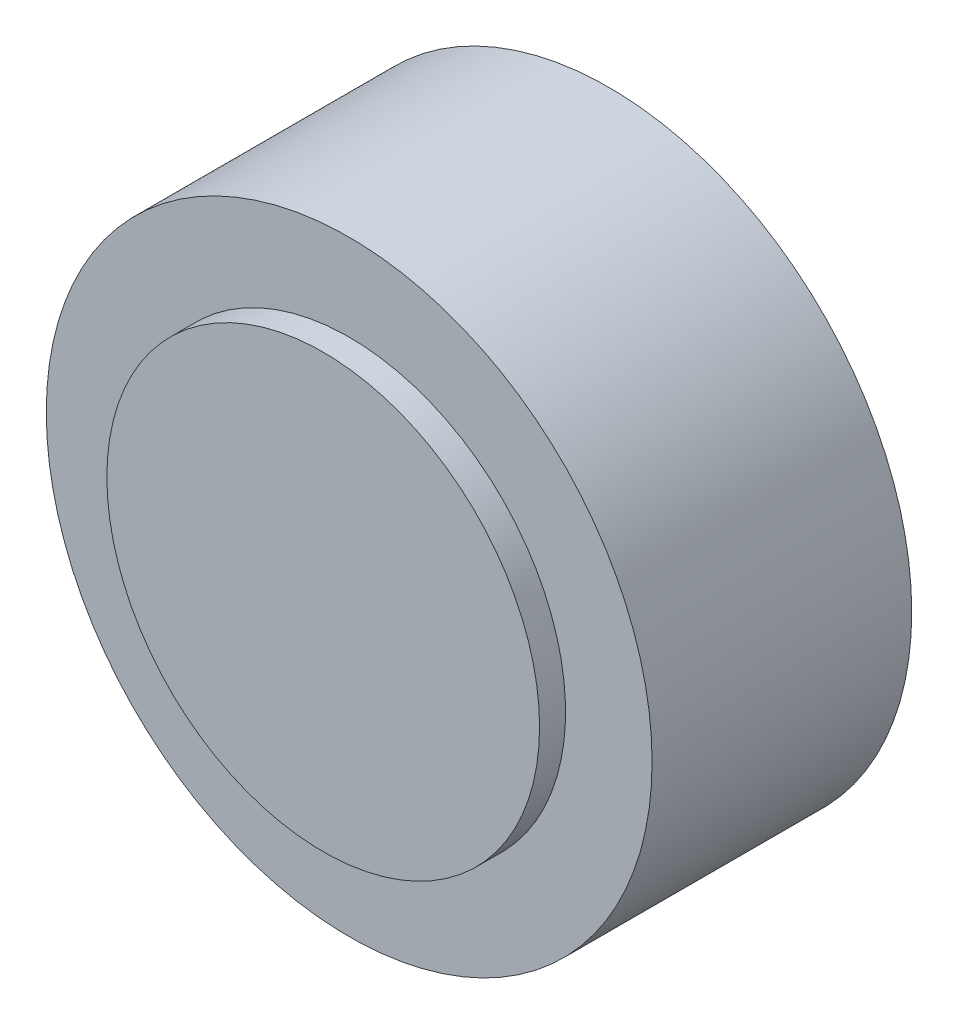
ISO-10303-21;
HEADER;
FILE_DESCRIPTION(('STEP AP214'),'2;1');
FILE_NAME('part.step','',(''),(''),'','','');
FILE_SCHEMA(('AUTOMOTIVE_DESIGN { 1 0 10303 214 1 1 1 1 }'));
ENDSEC;
DATA;
#1=APPLICATION_CONTEXT('core data for automotive mechanical design processes');
#2=APPLICATION_PROTOCOL_DEFINITION('international standard','automotive_design',2000,#1);
#3=PRODUCT_CONTEXT('',#1,'mechanical');
#4=PRODUCT('Part','Part','',(#3));
#5=PRODUCT_RELATED_PRODUCT_CATEGORY('part','',(#4));
#6=PRODUCT_DEFINITION_FORMATION('','',#4);
#7=PRODUCT_DEFINITION_CONTEXT('part definition',#1,'design');
#8=PRODUCT_DEFINITION('design','',#6,#7);
#9=PRODUCT_DEFINITION_SHAPE('','',#8);
#10=(LENGTH_UNIT() NAMED_UNIT(*) SI_UNIT(.MILLI.,.METRE.));
#11=(NAMED_UNIT(*) PLANE_ANGLE_UNIT() SI_UNIT($,.RADIAN.));
#12=(NAMED_UNIT(*) SI_UNIT($,.STERADIAN.) SOLID_ANGLE_UNIT());
#13=UNCERTAINTY_MEASURE_WITH_UNIT(LENGTH_MEASURE(1.E-05),#10,'distance_accuracy_value','');
#14=(GEOMETRIC_REPRESENTATION_CONTEXT(3) GLOBAL_UNCERTAINTY_ASSIGNED_CONTEXT((#13)) GLOBAL_UNIT_ASSIGNED_CONTEXT((#10,
#11,#12)) REPRESENTATION_CONTEXT('',''));
#15=CARTESIAN_POINT('',(0.,0.,0.));
#16=DIRECTION('',(0.,0.,1.));
#17=DIRECTION('',(1.,0.,0.));
#18=AXIS2_PLACEMENT_3D('',#15,#16,#17);
#19=CARTESIAN_POINT('',(0.,0.,-5.));
#20=DIRECTION('',(0.,0.,1.));
#21=DIRECTION('',(1.,0.,0.));
#22=AXIS2_PLACEMENT_3D('',#19,#20,#21);
#23=CYLINDRICAL_SURFACE('',#22,7.);
#24=CARTESIAN_POINT('',(0.,0.,-5.));
#25=DIRECTION('',(0.,0.,-1.));
#26=DIRECTION('',(-1.,0.,0.));
#27=AXIS2_PLACEMENT_3D('',#24,#25,#26);
#28=CIRCLE('',#27,7.);
#29=CARTESIAN_POINT('',(-7.,0.,-5.));
#30=VERTEX_POINT('',#29);
#31=EDGE_CURVE('E60',#30,#30,#28,.T.);
#32=ORIENTED_EDGE('',*,*,#31,.F.);
#33=EDGE_LOOP('',(#32));
#34=FACE_BOUND('',#33,.T.);
#35=CARTESIAN_POINT('',(0.,0.,0.));
#36=DIRECTION('',(0.,0.,-1.));
#37=DIRECTION('',(-1.,0.,0.));
#38=AXIS2_PLACEMENT_3D('',#35,#36,#37);
#39=CIRCLE('',#38,7.);
#40=CARTESIAN_POINT('',(-7.,0.,0.));
#41=VERTEX_POINT('',#40);
#42=EDGE_CURVE('E10',#41,#41,#39,.T.);
#43=ORIENTED_EDGE('',*,*,#42,.T.);
#44=EDGE_LOOP('',(#43));
#45=FACE_BOUND('',#44,.T.);
#46=CARTESIAN_POINT('',(0.,7.,-4.));
#47=CARTESIAN_POINT('',(-0.0832358860906166,6.99999846043226,-3.9999971004257));
#48=CARTESIAN_POINT('',(-0.166507195600275,6.9985002594971,-3.99304839161214));
#49=CARTESIAN_POINT('',(-0.330687344293327,6.99266829827728,-3.96546434314641));
#50=CARTESIAN_POINT('',(-0.41159440357119,6.98833245637099,-3.94481895580507));
#51=CARTESIAN_POINT('',(-0.568649323817737,6.97730831788827,-3.89051563539196));
#52=CARTESIAN_POINT('',(-0.644801963446556,6.97062242967171,-3.85687102061868));
#53=CARTESIAN_POINT('',(-0.790378177960787,6.95562106817971,-3.77756591382874));
#54=CARTESIAN_POINT('',(-0.859801981747369,6.94730565036661,-3.73190583075006));
#55=CARTESIAN_POINT('',(-0.991024790535229,6.92981369246311,-3.62911970032649));
#56=CARTESIAN_POINT('',(-1.05270503419445,6.92062683143259,-3.57184377810147));
#57=CARTESIAN_POINT('',(-1.16566042389435,6.90250069814144,-3.4477736843148));
#58=CARTESIAN_POINT('',(-1.21693467150908,6.8935614473163,-3.38097869174874));
#59=CARTESIAN_POINT('',(-1.30814204379809,6.87684116047225,-3.23889424713957));
#60=CARTESIAN_POINT('',(-1.34794958335009,6.8690733634436,-3.16352248224379));
#61=CARTESIAN_POINT('',(-1.41428823691148,6.85572325558537,-3.00696554623316));
#62=CARTESIAN_POINT('',(-1.44082087001716,6.85014069470711,-2.92578104150743));
#63=CARTESIAN_POINT('',(-1.47946574422454,6.84189808926311,-2.76118891341192));
#64=CARTESIAN_POINT('',(-1.49178779748342,6.83919556896486,-2.67783272433613));
#65=CARTESIAN_POINT('',(-1.50231395206577,6.83689139845106,-2.510195767493));
#66=CARTESIAN_POINT('',(-1.50051971664629,6.83728938291729,-2.42591510982005));
#67=CARTESIAN_POINT('',(-1.48303326340861,6.84110276603832,-2.26037531206621));
#68=CARTESIAN_POINT('',(-1.46758398649408,6.84446541682162,-2.17908911089985));
#69=CARTESIAN_POINT('',(-1.42361054298677,6.85374593375788,-2.02028975971066));
#70=CARTESIAN_POINT('',(-1.39508566936466,6.85966393808402,-1.94277681396768));
#71=CARTESIAN_POINT('',(-1.32554551075991,6.87344080755724,-1.79303712712666));
#72=CARTESIAN_POINT('',(-1.2844361097283,6.88131420983365,-1.72085548728745));
#73=CARTESIAN_POINT('',(-1.19096007283993,6.89810572501288,-1.58432483504204));
#74=CARTESIAN_POINT('',(-1.13859196103562,6.90702397481896,-1.5199768513138));
#75=CARTESIAN_POINT('',(-1.0227954275532,6.92512718393878,-1.3995406443266));
#76=CARTESIAN_POINT('',(-0.959160233964409,6.93431383972178,-1.34365129341526));
#77=CARTESIAN_POINT('',(-0.823317306269096,6.95175017497059,-1.24330626631034));
#78=CARTESIAN_POINT('',(-0.751109428775399,6.95999983875972,-1.19885078139961));
#79=CARTESIAN_POINT('',(-0.599933462049958,6.97465778534003,-1.12258932009307));
#80=CARTESIAN_POINT('',(-0.520952258863482,6.98106238643354,-1.09080858742202));
#81=CARTESIAN_POINT('',(-0.358603146685706,6.99128109245334,-1.04102435167891));
#82=CARTESIAN_POINT('',(-0.275235851133668,6.99509555860384,-1.02301892743668));
#83=CARTESIAN_POINT('',(-0.108187670836628,6.99965306347808,-1.00158378585658));
#84=CARTESIAN_POINT('',(-0.0245431772716141,7.00045336521066,-0.99788228711822));
#85=CARTESIAN_POINT('',(0.142168973650405,6.99905248935969,-1.00442457112516));
#86=CARTESIAN_POINT('',(0.225236668127256,6.99685150675698,-1.01466744796294));
#87=CARTESIAN_POINT('',(0.387542537982806,6.98973143045266,-1.0485822436617));
#88=CARTESIAN_POINT('',(0.466811712908478,6.9848410504546,-1.07211236947253));
#89=CARTESIAN_POINT('',(0.620278450473418,6.9728892442151,-1.13177694299482));
#90=CARTESIAN_POINT('',(0.69447559258774,6.96582763822237,-1.16791243431165));
#91=CARTESIAN_POINT('',(0.836821397964754,6.950175043904,-1.25233354306033));
#92=CARTESIAN_POINT('',(0.90487257511114,6.94156431354275,-1.30077979490973));
#93=CARTESIAN_POINT('',(1.0319769255236,6.92381033034847,-1.40823482488874));
#94=CARTESIAN_POINT('',(1.091028978692,6.91466701142097,-1.46724491588744));
#95=CARTESIAN_POINT('',(1.19952711057989,6.89668172706324,-1.59539737018714));
#96=CARTESIAN_POINT('',(1.24878537255157,6.88784792221285,-1.6647000992221));
#97=CARTESIAN_POINT('',(1.3349641538604,6.87166654559681,-1.81075459647799));
#98=CARTESIAN_POINT('',(1.37188519913706,6.86431891048055,-1.88750604697749));
#99=CARTESIAN_POINT('',(1.43209741248548,6.8520100980739,-2.0458722989946));
#100=CARTESIAN_POINT('',(1.45546398641275,6.84703574582967,-2.12745735643067));
#101=CARTESIAN_POINT('',(1.48812696085335,6.84001186708418,-2.29351558383364));
#102=CARTESIAN_POINT('',(1.49742550780258,6.83796189439706,-2.37798831120132));
#103=CARTESIAN_POINT('',(1.5015999992604,6.83704618848155,-2.54553234317524));
#104=CARTESIAN_POINT('',(1.49677347258311,6.83811476518543,-2.62859601498058));
#105=CARTESIAN_POINT('',(1.47349789406331,6.8431676318483,-2.79269724213259));
#106=CARTESIAN_POINT('',(1.45504898957979,6.84715189026714,-2.87373481938657));
#107=CARTESIAN_POINT('',(1.40519345940434,6.85755581104157,-3.03125865786917));
#108=CARTESIAN_POINT('',(1.37382847170887,6.86396764224703,-3.10775864866429));
#109=CARTESIAN_POINT('',(1.29906751595601,6.87850764590649,-3.25445537250685));
#110=CARTESIAN_POINT('',(1.255670353015,6.88663598880363,-3.32465147861504));
#111=CARTESIAN_POINT('',(1.15708290349304,6.90389055593232,-3.45821819372537));
#112=CARTESIAN_POINT('',(1.10167987421237,6.91303309938926,-3.52142969594698));
#113=CARTESIAN_POINT('',(0.981086554619619,6.93117449799694,-3.63775626252046));
#114=CARTESIAN_POINT('',(0.915894009385596,6.94017331951296,-3.69086899431221));
#115=CARTESIAN_POINT('',(0.776603147268716,6.95714491048987,-3.78611595950556));
#116=CARTESIAN_POINT('',(0.702404846009641,6.96510364570626,-3.82810660623098));
#117=CARTESIAN_POINT('',(0.547850160940598,6.97895826104019,-3.89895452890618));
#118=CARTESIAN_POINT('',(0.467499105863879,6.98485590212343,-3.92782302258504));
#119=CARTESIAN_POINT('',(0.322535217553203,6.99284848461772,-3.96635218513115));
#120=CARTESIAN_POINT('',(0.258717205545978,6.99551391888263,-3.97894643398003));
#121=CARTESIAN_POINT('',(0.129939960853846,6.99909024154719,-3.99577130171167));
#122=CARTESIAN_POINT('',(0.0649807750887446,7.00000120191314,-4.00000226364606));
#123=CARTESIAN_POINT('',(0.,7.,-4.));
#124=B_SPLINE_CURVE_WITH_KNOTS('',3,(#46,#47,#48,#49,#50,#51,#52,#53,#54,#55,#56,#57,#58,#59,
#60,#61,#62,#63,#64,#65,#66,#67,#68,#69,#70,#71,#72,#73,#74,#75,#76,#77,#78,#79,#80,#81,#82,#83,
#84,#85,#86,#87,#88,#89,#90,#91,#92,#93,#94,#95,#96,#97,#98,#99,#100,#101,#102,#103,#104,#105,
#106,#107,#108,#109,#110,#111,#112,#113,#114,#115,#116,#117,#118,#119,#120,#121,#122,#123),
.UNSPECIFIED.,.T.,.F.,(4,2,2,2,2,2,2,2,2,2,2,2,2,2,2,2,2,2,2,2,2,2,2,2,2,2,2,2,2,2,2,2,2,2,2,2,
2,2,4),(0.,0.249469836512082,0.499122883219936,0.748520824425602,0.997910278645886,
1.25074961881732,1.50361077918506,1.7591442921451,2.0146485567749,2.26633008124666,
2.51798195169165,2.76524475452928,3.01252092904568,3.26169356165968,3.51089887920889,
3.76527011050291,4.0196455970235,4.27452521139806,4.52936927256343,4.77934665704185,
5.02930780231429,5.27665060589267,5.52401389198434,5.77478733867803,6.02559197304485,
6.28082063283534,6.53603841075806,6.78982240408475,7.04356767229185,7.29200680540294,
7.5404432510827,7.78808499706785,8.03575134451623,8.28822950154114,8.54076590397115,
8.79641910357222,9.05185334010271,9.24661799132294,9.44137465337336),.UNSPECIFIED.);
#125=CARTESIAN_POINT('',(0.,7.,-4.));
#126=VERTEX_POINT('',#125);
#127=EDGE_CURVE('E115',#126,#126,#124,.T.);
#128=ORIENTED_EDGE('',*,*,#127,.F.);
#129=EDGE_LOOP('',(#128));
#130=FACE_BOUND('',#129,.T.);
#131=ADVANCED_FACE('F37',(#34,#45,#130),#23,.T.);
#132=CARTESIAN_POINT('',(0.,0.,-5.));
#133=DIRECTION('',(0.,0.,1.));
#134=DIRECTION('',(1.,0.,0.));
#135=AXIS2_PLACEMENT_3D('',#132,#133,#134);
#136=CYLINDRICAL_SURFACE('',#135,2.);
#137=CARTESIAN_POINT('',(0.,0.,0.));
#138=DIRECTION('',(0.,0.,-1.));
#139=DIRECTION('',(-1.,0.,0.));
#140=AXIS2_PLACEMENT_3D('',#137,#138,#139);
#141=CIRCLE('',#140,2.);
#142=CARTESIAN_POINT('',(-2.,0.,0.));
#143=VERTEX_POINT('',#142);
#144=EDGE_CURVE('E122',#143,#143,#141,.T.);
#145=ORIENTED_EDGE('',*,*,#144,.F.);
#146=EDGE_LOOP('',(#145));
#147=FACE_BOUND('',#146,.T.);
#148=CARTESIAN_POINT('',(0.,0.,-5.));
#149=DIRECTION('',(0.,0.,-1.));
#150=DIRECTION('',(-1.,0.,0.));
#151=AXIS2_PLACEMENT_3D('',#148,#149,#150);
#152=CIRCLE('',#151,2.);
#153=CARTESIAN_POINT('',(-2.,0.,-5.));
#154=VERTEX_POINT('',#153);
#155=EDGE_CURVE('E123',#154,#154,#152,.T.);
#156=ORIENTED_EDGE('',*,*,#155,.T.);
#157=EDGE_LOOP('',(#156));
#158=FACE_BOUND('',#157,.T.);
#159=CARTESIAN_POINT('',(0.,2.,-4.));
#160=CARTESIAN_POINT('',(-0.0732207358411543,1.99999540196395,-3.99999520798798));
#161=CARTESIAN_POINT('',(-0.146561062021485,1.99593645526274,-3.9945949756255));
#162=CARTESIAN_POINT('',(-0.290936396286467,1.98006607281083,-3.97333293658984));
#163=CARTESIAN_POINT('',(-0.361965136229004,1.96823514679854,-3.95744482834995));
#164=CARTESIAN_POINT('',(-0.499234626631249,1.9379567495606,-3.91628709071623));
#165=CARTESIAN_POINT('',(-0.565501615403737,1.91954951932009,-3.89107448643083));
#166=CARTESIAN_POINT('',(-0.692422335520753,1.87750556721694,-3.83245765581277));
#167=CARTESIAN_POINT('',(-0.753077701796332,1.85387037535483,-3.79905582580648));
#168=CARTESIAN_POINT('',(-0.873465937590145,1.80049544543983,-3.72173698840918));
#169=CARTESIAN_POINT('',(-0.932593229272032,1.7703930854844,-3.67713267066593));
#170=CARTESIAN_POINT('',(-1.04302716767671,1.70767017883378,-3.58050416263883));
#171=CARTESIAN_POINT('',(-1.09432148272226,1.67504578078609,-3.52846851720017));
#172=CARTESIAN_POINT('',(-1.19837161436623,1.6027112365199,-3.40641704672163));
#173=CARTESIAN_POINT('',(-1.24930578421204,1.56290854864639,-3.3348963228783));
#174=CARTESIAN_POINT('',(-1.33861998176348,1.48711444664135,-3.18254898763345));
#175=CARTESIAN_POINT('',(-1.37701716983077,1.45111786883675,-3.10173530299969));
#176=CARTESIAN_POINT('',(-1.42880627811788,1.39977155180179,-2.96049716132377));
#177=CARTESIAN_POINT('',(-1.44625674456539,1.38157751186733,-2.90260930287162));
#178=CARTESIAN_POINT('',(-1.47420672564844,1.35171594150685,-2.78360726521508));
#179=CARTESIAN_POINT('',(-1.48472215355267,1.34003347910832,-2.72250082212521));
#180=CARTESIAN_POINT('',(-1.49812822141445,1.32503759684553,-2.59781741446923));
#181=CARTESIAN_POINT('',(-1.50094954854207,1.32180026676597,-2.53422319327594));
#182=CARTESIAN_POINT('',(-1.49848213241869,1.32459531776068,-2.40738508911843));
#183=CARTESIAN_POINT('',(-1.49319048157349,1.33063102218113,-2.34414133991256));
#184=CARTESIAN_POINT('',(-1.47597739291882,1.34967623262519,-2.22680865257421));
#185=CARTESIAN_POINT('',(-1.46482486380817,1.36187157059871,-2.17246362895382));
#186=CARTESIAN_POINT('',(-1.43705671120732,1.39114192844939,-2.06656112127912));
#187=CARTESIAN_POINT('',(-1.42043583681172,1.40822163640769,-2.0150063721764));
#188=CARTESIAN_POINT('',(-1.37033064172535,1.45741769294306,-1.88374361336585));
#189=CARTESIAN_POINT('',(-1.3328014849398,1.49225649139233,-1.80659958335649));
#190=CARTESIAN_POINT('',(-1.24618023314519,1.56533298145196,-1.66080347613092));
#191=CARTESIAN_POINT('',(-1.19706004255878,1.60357878886109,-1.59217266074534));
#192=CARTESIAN_POINT('',(-1.08651604102135,1.68051672313145,-1.46224660959635));
#193=CARTESIAN_POINT('',(-1.02481375526036,1.71919586730239,-1.40117939311852));
#194=CARTESIAN_POINT('',(-0.890422521709589,1.79248037980972,-1.28973635321884));
#195=CARTESIAN_POINT('',(-0.817755054293756,1.8270934826376,-1.23934007976962));
#196=CARTESIAN_POINT('',(-0.677902080454142,1.88279726073643,-1.16001920075967));
#197=CARTESIAN_POINT('',(-0.612539870185619,1.90520770945008,-1.12881540578422));
#198=CARTESIAN_POINT('',(-0.476352173202086,1.94372904416948,-1.07577511953614));
#199=CARTESIAN_POINT('',(-0.405530141063765,1.95984387504352,-1.05393276150072));
#200=CARTESIAN_POINT('',(-0.259676232483518,1.98445588635989,-1.02074663711356));
#201=CARTESIAN_POINT('',(-0.184621281405942,1.99290592971749,-1.00946782106137));
#202=CARTESIAN_POINT('',(-0.0332012397969162,2.00115883659445,-0.998450402628294));
#203=CARTESIAN_POINT('',(0.0431632843727241,2.00096534845408,-0.998706931304634));
#204=CARTESIAN_POINT('',(0.186804217329626,1.99242547175873,-1.01011086927319));
#205=CARTESIAN_POINT('',(0.254222327546133,1.98490086600401,-1.02016053688867));
#206=CARTESIAN_POINT('',(0.386110670609118,1.96351320201588,-1.04897378000787));
#207=CARTESIAN_POINT('',(0.450580272987261,1.94964879507262,-1.06773920968941));
#208=CARTESIAN_POINT('',(0.57741677968977,1.91599830683313,-1.1138875305931));
#209=CARTESIAN_POINT('',(0.639629172536139,1.89602050290193,-1.1415511814274));
#210=CARTESIAN_POINT('',(0.758518527043073,1.85166985411963,-1.20417245542559));
#211=CARTESIAN_POINT('',(0.815194721336403,1.82729640132068,-1.23913108763974));
#212=CARTESIAN_POINT('',(0.931511626319037,1.77119146886499,-1.32178324641056));
#213=CARTESIAN_POINT('',(0.990066762698702,1.73891095025037,-1.37062853943746));
#214=CARTESIAN_POINT('',(1.09871974855854,1.67238952874785,-1.47600875258839));
#215=CARTESIAN_POINT('',(1.14879830469577,1.63814438507395,-1.53256069969336));
#216=CARTESIAN_POINT('',(1.24877541075626,1.56369128291497,-1.66414988096118));
#217=CARTESIAN_POINT('',(1.29683043648705,1.523587185201,-1.7406575614923));
#218=CARTESIAN_POINT('',(1.37923235998283,1.4494059134845,-1.90336007797245));
#219=CARTESIAN_POINT('',(1.41362000515519,1.41531099570969,-1.98952512190858));
#220=CARTESIAN_POINT('',(1.45615734256767,1.37118877808583,-2.13541444887448));
#221=CARTESIAN_POINT('',(1.46931009512996,1.35695811824565,-2.19239112640238));
#222=CARTESIAN_POINT('',(1.48891522181906,1.33542056103011,-2.30870704698318));
#223=CARTESIAN_POINT('',(1.4953825519924,1.32809821220233,-2.36804070680225));
#224=CARTESIAN_POINT('',(1.50115320209064,1.32157601792209,-2.48782907981133));
#225=CARTESIAN_POINT('',(1.50042015325262,1.32241740684975,-2.54828794300957));
#226=CARTESIAN_POINT('',(1.49176883838219,1.33216448543666,-2.66805683875216));
#227=CARTESIAN_POINT('',(1.48384130024584,1.34108058157484,-2.72736528789726));
#228=CARTESIAN_POINT('',(1.45893841819723,1.36817348797773,-2.8559145714108));
#229=CARTESIAN_POINT('',(1.44036567954111,1.38794705950643,-2.92449718013277));
#230=CARTESIAN_POINT('',(1.39469627266119,1.4338296338541,-3.05653484883048));
#231=CARTESIAN_POINT('',(1.3675780729773,1.4599546014693,-3.11997644203819));
#232=CARTESIAN_POINT('',(1.29498918933642,1.52516477328824,-3.26252063048633));
#233=CARTESIAN_POINT('',(1.2464154206597,1.56560203191105,-3.33942158275575));
#234=CARTESIAN_POINT('',(1.13650718465936,1.64713510181273,-3.48312604497756));
#235=CARTESIAN_POINT('',(1.07516134758577,1.68823146954222,-3.54992046594485));
#236=CARTESIAN_POINT('',(0.93962714493789,1.76728988939793,-3.67283184228333));
#237=CARTESIAN_POINT('',(0.865337161562859,1.80522333711072,-3.7288563193772));
#238=CARTESIAN_POINT('',(0.705159098936202,1.87357289668097,-3.82722305114535));
#239=CARTESIAN_POINT('',(0.619299420401793,1.90400691592959,-3.86959797457251));
#240=CARTESIAN_POINT('',(0.464840290356453,1.94636704624048,-3.92779942098571));
#241=CARTESIAN_POINT('',(0.398553614774731,1.96110322499718,-3.94776673137617));
#242=CARTESIAN_POINT('',(0.262841610392759,1.98383739970238,-3.97841790261149));
#243=CARTESIAN_POINT('',(0.193425623834904,1.99185421210894,-3.98912769024996));
#244=CARTESIAN_POINT('',(0.102963309861888,1.99745471706309,-3.99660469421435));
#245=CARTESIAN_POINT('',(0.0824069459941229,1.9984076143208,-3.99787627748942));
#246=CARTESIAN_POINT('',(0.0412368896243779,1.99968095423138,-3.99957467323097));
#247=CARTESIAN_POINT('',(0.0206231884283879,2.00000129507253,-4.00000134970737));
#248=CARTESIAN_POINT('',(0.,2.,-4.));
#249=B_SPLINE_CURVE_WITH_KNOTS('',3,(#159,#160,#161,#162,#163,#164,#165,#166,#167,#168,#169,
#170,#171,#172,#173,#174,#175,#176,#177,#178,#179,#180,#181,#182,#183,#184,#185,#186,#187,#188,
#189,#190,#191,#192,#193,#194,#195,#196,#197,#198,#199,#200,#201,#202,#203,#204,#205,#206,#207,
#208,#209,#210,#211,#212,#213,#214,#215,#216,#217,#218,#219,#220,#221,#222,#223,#224,#225,#226,
#227,#228,#229,#230,#231,#232,#233,#234,#235,#236,#237,#238,#239,#240,#241,#242,#243,#244,#245,
#246,#247,#248),.UNSPECIFIED.,.T.,.F.,(4,2,2,2,2,2,2,2,2,2,2,2,2,2,2,2,2,2,2,2,2,2,2,2,2,2,2,2,
2,2,2,2,2,2,2,2,2,2,2,2,2,2,2,2,4),(0.,0.219571786572042,0.439696319423243,0.658496333573381,
0.877232398849293,1.1162243131743,1.35558868405162,1.64360015887451,1.93121574056507,
2.11999518529901,2.3083399319529,2.49837587621257,2.6884799430021,2.85826890162709,
3.0282213760064,3.3044933180591,3.58144192357889,3.8653588393809,4.14872662493691,
4.37526505006389,4.60166129643117,4.82944058166898,5.05712372466613,5.26191187011994,
5.46674360185812,5.6788043948368,5.89089453977541,6.13840382081868,6.38646908985452,
6.68168596015947,6.97601595850113,7.15589161422933,7.33536399114208,7.51574333854741,
7.69635548563854,7.91639670960134,8.13699685139921,8.43412246655768,8.73151372390893,
9.0313544949265,9.33047220273164,9.5419569754163,9.75284752283256,9.81468166878711,
9.87652576630966),.UNSPECIFIED.);
#250=CARTESIAN_POINT('',(0.,2.,-4.));
#251=VERTEX_POINT('',#250);
#252=EDGE_CURVE('E41',#251,#251,#249,.T.);
#253=ORIENTED_EDGE('',*,*,#252,.T.);
#254=EDGE_LOOP('',(#253));
#255=FACE_BOUND('',#254,.T.);
#256=ADVANCED_FACE('F103',(#147,#158,#255),#136,.F.);
#257=CARTESIAN_POINT('',(0.,0.,35.));
#258=DIRECTION('',(0.,0.,-1.));
#259=DIRECTION('',(-1.,0.,0.));
#260=AXIS2_PLACEMENT_3D('',#257,#258,#259);
#261=CYLINDRICAL_SURFACE('',#260,25.);
#262=CARTESIAN_POINT('',(0.,0.,35.));
#263=DIRECTION('',(0.,0.,1.));
#264=DIRECTION('',(1.,0.,0.));
#265=AXIS2_PLACEMENT_3D('',#262,#263,#264);
#266=CIRCLE('',#265,25.);
#267=CARTESIAN_POINT('',(25.,0.,35.));
#268=VERTEX_POINT('',#267);
#269=EDGE_CURVE('E57',#268,#268,#266,.T.);
#270=ORIENTED_EDGE('',*,*,#269,.F.);
#271=EDGE_LOOP('',(#270));
#272=FACE_BOUND('',#271,.T.);
#273=CARTESIAN_POINT('',(0.,0.,32.));
#274=DIRECTION('',(0.,0.,-1.));
#275=DIRECTION('',(-1.,0.,0.));
#276=AXIS2_PLACEMENT_3D('',#273,#274,#275);
#277=CIRCLE('',#276,25.);
#278=CARTESIAN_POINT('',(-25.,0.,32.));
#279=VERTEX_POINT('',#278);
#280=EDGE_CURVE('E51',#279,#279,#277,.T.);
#281=ORIENTED_EDGE('',*,*,#280,.F.);
#282=EDGE_LOOP('',(#281));
#283=FACE_BOUND('',#282,.T.);
#284=ADVANCED_FACE('F94',(#272,#283),#261,.T.);
#285=CARTESIAN_POINT('',(0.,0.,35.));
#286=DIRECTION('',(0.,0.,1.));
#287=DIRECTION('',(1.,0.,0.));
#288=AXIS2_PLACEMENT_3D('',#285,#286,#287);
#289=PLANE('',#288);
#290=ORIENTED_EDGE('',*,*,#269,.T.);
#291=EDGE_LOOP('',(#290));
#292=FACE_BOUND('',#291,.T.);
#293=ADVANCED_FACE('F180',(#292),#289,.T.);
#294=CARTESIAN_POINT('',(0.,0.,32.));
#295=DIRECTION('',(0.,0.,-1.));
#296=DIRECTION('',(-1.,0.,0.));
#297=AXIS2_PLACEMENT_3D('',#294,#295,#296);
#298=CYLINDRICAL_SURFACE('',#297,35.);
#299=CARTESIAN_POINT('',(0.,0.,32.));
#300=DIRECTION('',(0.,0.,-1.));
#301=DIRECTION('',(-1.,0.,0.));
#302=AXIS2_PLACEMENT_3D('',#299,#300,#301);
#303=CIRCLE('',#302,35.);
#304=CARTESIAN_POINT('',(-35.,0.,32.));
#305=VERTEX_POINT('',#304);
#306=EDGE_CURVE('E67',#305,#305,#303,.T.);
#307=ORIENTED_EDGE('',*,*,#306,.T.);
#308=EDGE_LOOP('',(#307));
#309=FACE_BOUND('',#308,.T.);
#310=CARTESIAN_POINT('',(0.,0.,2.));
#311=DIRECTION('',(0.,0.,-1.));
#312=DIRECTION('',(-1.,0.,0.));
#313=AXIS2_PLACEMENT_3D('',#310,#311,#312);
#314=CIRCLE('',#313,35.);
#315=CARTESIAN_POINT('',(-35.,0.,2.));
#316=VERTEX_POINT('',#315);
#317=EDGE_CURVE('E66',#316,#316,#314,.T.);
#318=ORIENTED_EDGE('',*,*,#317,.F.);
#319=EDGE_LOOP('',(#318));
#320=FACE_BOUND('',#319,.T.);
#321=ADVANCED_FACE('F188',(#309,#320),#298,.T.);
#322=CARTESIAN_POINT('',(0.,0.,32.));
#323=DIRECTION('',(0.,0.,-1.));
#324=DIRECTION('',(-1.,0.,0.));
#325=AXIS2_PLACEMENT_3D('',#322,#323,#324);
#326=PLANE('',#325);
#327=ORIENTED_EDGE('',*,*,#280,.T.);
#328=EDGE_LOOP('',(#327));
#329=FACE_BOUND('',#328,.T.);
#330=ORIENTED_EDGE('',*,*,#306,.F.);
#331=EDGE_LOOP('',(#330));
#332=FACE_BOUND('',#331,.T.);
#333=ADVANCED_FACE('F95',(#329,#332),#326,.F.);
#334=CARTESIAN_POINT('',(0.,0.,2.));
#335=DIRECTION('',(0.,0.,-1.));
#336=DIRECTION('',(-1.,0.,0.));
#337=AXIS2_PLACEMENT_3D('',#334,#335,#336);
#338=PLANE('',#337);
#339=CARTESIAN_POINT('',(0.,0.,2.));
#340=DIRECTION('',(0.,0.,-1.));
#341=DIRECTION('',(-1.,0.,0.));
#342=AXIS2_PLACEMENT_3D('',#339,#340,#341);
#343=CIRCLE('',#342,25.);
#344=CARTESIAN_POINT('',(-25.,0.,2.));
#345=VERTEX_POINT('',#344);
#346=EDGE_CURVE('E62',#345,#345,#343,.T.);
#347=ORIENTED_EDGE('',*,*,#346,.F.);
#348=EDGE_LOOP('',(#347));
#349=FACE_BOUND('',#348,.T.);
#350=ORIENTED_EDGE('',*,*,#317,.T.);
#351=EDGE_LOOP('',(#350));
#352=FACE_BOUND('',#351,.T.);
#353=ADVANCED_FACE('F85',(#349,#352),#338,.T.);
#354=CARTESIAN_POINT('',(0.,0.,0.));
#355=DIRECTION('',(0.,0.,1.));
#356=DIRECTION('',(1.,0.,0.));
#357=AXIS2_PLACEMENT_3D('',#354,#355,#356);
#358=PLANE('',#357);
#359=ORIENTED_EDGE('',*,*,#42,.F.);
#360=EDGE_LOOP('',(#359));
#361=FACE_BOUND('',#360,.T.);
#362=CARTESIAN_POINT('',(0.,0.,0.));
#363=DIRECTION('',(0.,0.,1.));
#364=DIRECTION('',(1.,0.,0.));
#365=AXIS2_PLACEMENT_3D('',#362,#363,#364);
#366=CIRCLE('',#365,25.);
#367=CARTESIAN_POINT('',(25.,0.,0.));
#368=VERTEX_POINT('',#367);
#369=EDGE_CURVE('E71',#368,#368,#366,.T.);
#370=ORIENTED_EDGE('',*,*,#369,.F.);
#371=EDGE_LOOP('',(#370));
#372=FACE_BOUND('',#371,.T.);
#373=ADVANCED_FACE('F83',(#361,#372),#358,.F.);
#374=ORIENTED_EDGE('',*,*,#346,.T.);
#375=EDGE_LOOP('',(#374));
#376=FACE_BOUND('',#375,.T.);
#377=ORIENTED_EDGE('',*,*,#369,.T.);
#378=EDGE_LOOP('',(#377));
#379=FACE_BOUND('',#378,.T.);
#380=ADVANCED_FACE('F39',(#376,#379),#261,.T.);
#381=CARTESIAN_POINT('',(0.,0.,-5.));
#382=DIRECTION('',(0.,0.,-1.));
#383=DIRECTION('',(-1.,0.,0.));
#384=AXIS2_PLACEMENT_3D('',#381,#382,#383);
#385=PLANE('',#384);
#386=ORIENTED_EDGE('',*,*,#31,.T.);
#387=EDGE_LOOP('',(#386));
#388=FACE_BOUND('',#387,.T.);
#389=ORIENTED_EDGE('',*,*,#155,.F.);
#390=EDGE_LOOP('',(#389));
#391=FACE_BOUND('',#390,.T.);
#392=ADVANCED_FACE('F92',(#388,#391),#385,.T.);
#393=ORIENTED_EDGE('',*,*,#144,.T.);
#394=EDGE_LOOP('',(#393));
#395=FACE_BOUND('',#394,.T.);
#396=ADVANCED_FACE('F87',(#395),#358,.F.);
#397=CARTESIAN_POINT('',(0.,35.,-2.5));
#398=DIRECTION('',(0.,-1.,0.));
#399=DIRECTION('',(0.,0.,-1.));
#400=AXIS2_PLACEMENT_3D('',#397,#398,#399);
#401=CYLINDRICAL_SURFACE('',#400,1.5);
#402=ORIENTED_EDGE('',*,*,#252,.F.);
#403=EDGE_LOOP('',(#402));
#404=FACE_BOUND('',#403,.T.);
#405=ORIENTED_EDGE('',*,*,#127,.T.);
#406=EDGE_LOOP('',(#405));
#407=FACE_BOUND('',#406,.T.);
#408=ADVANCED_FACE('F100',(#404,#407),#401,.F.);
#409=CLOSED_SHELL('',(#131,#256,#284,#293,#321,#333,#353,#373,#380,#392,#396,#408));
#410=MANIFOLD_SOLID_BREP('B2',#409);
#411=ADVANCED_BREP_SHAPE_REPRESENTATION('',(#18,#410),#14);
#412=SHAPE_DEFINITION_REPRESENTATION(#9,#411);
ENDSEC;
END-ISO-10303-21;
